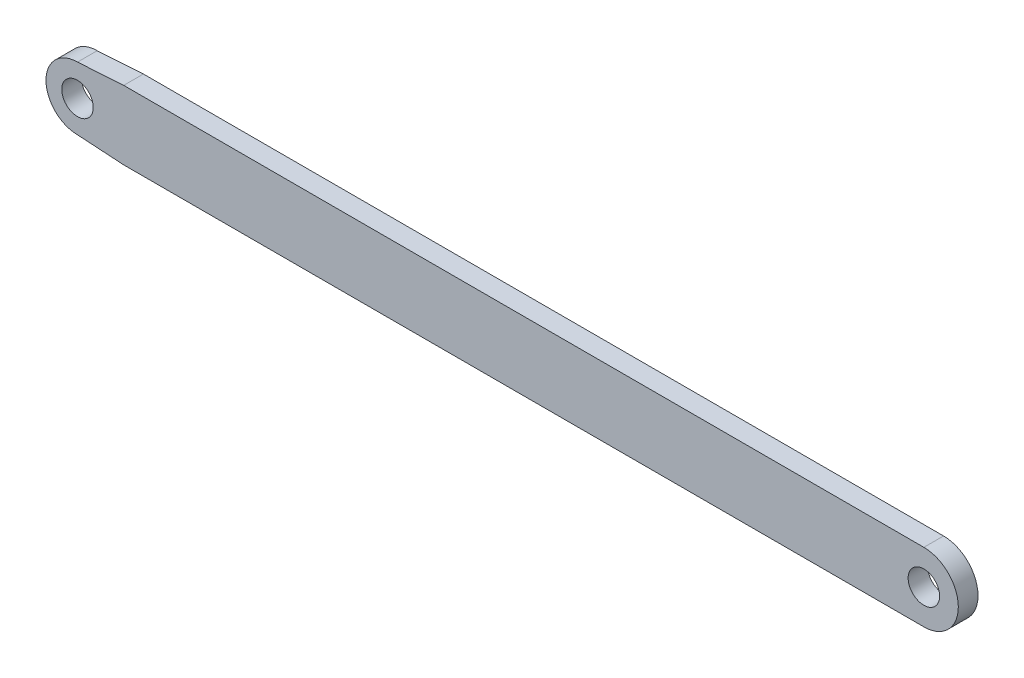
ISO-10303-21;
HEADER;
FILE_DESCRIPTION(('STEP AP214'),'2;1');
FILE_NAME('part.step','',(''),(''),'','','');
FILE_SCHEMA(('AUTOMOTIVE_DESIGN { 1 0 10303 214 1 1 1 1 }'));
ENDSEC;
DATA;
#1=APPLICATION_CONTEXT('core data for automotive mechanical design processes');
#2=APPLICATION_PROTOCOL_DEFINITION('international standard','automotive_design',2000,#1);
#3=PRODUCT_CONTEXT('',#1,'mechanical');
#4=PRODUCT('Part','Part','',(#3));
#5=PRODUCT_RELATED_PRODUCT_CATEGORY('part','',(#4));
#6=PRODUCT_DEFINITION_FORMATION('','',#4);
#7=PRODUCT_DEFINITION_CONTEXT('part definition',#1,'design');
#8=PRODUCT_DEFINITION('design','',#6,#7);
#9=PRODUCT_DEFINITION_SHAPE('','',#8);
#10=(LENGTH_UNIT() NAMED_UNIT(*) SI_UNIT(.MILLI.,.METRE.));
#11=(NAMED_UNIT(*) PLANE_ANGLE_UNIT() SI_UNIT($,.RADIAN.));
#12=(NAMED_UNIT(*) SI_UNIT($,.STERADIAN.) SOLID_ANGLE_UNIT());
#13=UNCERTAINTY_MEASURE_WITH_UNIT(LENGTH_MEASURE(1.E-05),#10,'distance_accuracy_value','');
#14=(GEOMETRIC_REPRESENTATION_CONTEXT(3) GLOBAL_UNCERTAINTY_ASSIGNED_CONTEXT((#13)) GLOBAL_UNIT_ASSIGNED_CONTEXT((#10,
#11,#12)) REPRESENTATION_CONTEXT('',''));
#15=CARTESIAN_POINT('',(0.,0.,0.));
#16=DIRECTION('',(0.,0.,1.));
#17=DIRECTION('',(1.,0.,0.));
#18=AXIS2_PLACEMENT_3D('',#15,#16,#17);
#19=CARTESIAN_POINT('',(1.56460188089036E-06,-8.75003844433416,5.));
#20=DIRECTION('',(-1.7881085790011E-07,0.999999999999984,0.));
#21=DIRECTION('',(-0.999999999999984,-1.7881085790011E-07,0.));
#22=AXIS2_PLACEMENT_3D('',#19,#20,#21);
#23=PLANE('',#22);
#24=DIRECTION('',(0.999999999999984,1.7881085790011E-07,0.));
#25=VECTOR('',#24,1.);
#26=CARTESIAN_POINT('',(1.56460188089036E-06,-8.75003844433416,0.));
#27=LINE('',#26,#25);
#28=CARTESIAN_POINT('',(7.45449875131523E-12,-8.75003844433444,0.));
#29=VERTEX_POINT('',#28);
#30=CARTESIAN_POINT('',(203.259167970718,-8.75000209938824,0.));
#31=VERTEX_POINT('',#30);
#32=EDGE_CURVE('E137',#29,#31,#27,.T.);
#33=ORIENTED_EDGE('',*,*,#32,.T.);
#34=DIRECTION('',(0.,0.,-1.));
#35=VECTOR('',#34,1.);
#36=CARTESIAN_POINT('',(203.259167970718,-8.75000209938824,5.));
#37=LINE('',#36,#35);
#38=CARTESIAN_POINT('',(203.259167970718,-8.75000209938824,5.));
#39=VERTEX_POINT('',#38);
#40=EDGE_CURVE('E11',#39,#31,#37,.T.);
#41=ORIENTED_EDGE('',*,*,#40,.F.);
#42=DIRECTION('',(0.999999999999984,1.7881085790011E-07,0.));
#43=VECTOR('',#42,1.);
#44=CARTESIAN_POINT('',(1.56460188089036E-06,-8.75003844433416,5.));
#45=LINE('',#44,#43);
#46=CARTESIAN_POINT('',(7.45449875131523E-12,-8.75003844433444,5.));
#47=VERTEX_POINT('',#46);
#48=EDGE_CURVE('E156',#47,#39,#45,.T.);
#49=ORIENTED_EDGE('',*,*,#48,.F.);
#50=DIRECTION('',(0.,0.,-1.));
#51=VECTOR('',#50,1.);
#52=CARTESIAN_POINT('',(7.45449875131523E-12,-8.75003844433444,5.));
#53=LINE('',#52,#51);
#54=EDGE_CURVE('E64',#47,#29,#53,.T.);
#55=ORIENTED_EDGE('',*,*,#54,.T.);
#56=EDGE_LOOP('',(#33,#41,#49,#55));
#57=FACE_BOUND('',#56,.T.);
#58=ADVANCED_FACE('F47',(#57),#23,.F.);
#59=CARTESIAN_POINT('',(203.259167970718,-2.09938810414106E-06,5.));
#60=DIRECTION('',(0.,0.,-1.));
#61=DIRECTION('',(-1.,0.,0.));
#62=AXIS2_PLACEMENT_3D('',#59,#60,#61);
#63=CYLINDRICAL_SURFACE('',#62,8.75);
#64=CARTESIAN_POINT('',(203.259167970718,-2.09938810414106E-06,0.));
#65=DIRECTION('',(0.,0.,1.));
#66=DIRECTION('',(1.,0.,0.));
#67=AXIS2_PLACEMENT_3D('',#64,#65,#66);
#68=CIRCLE('',#67,8.75);
#69=CARTESIAN_POINT('',(203.259167970718,8.7499979006119,0.));
#70=VERTEX_POINT('',#69);
#71=EDGE_CURVE('E140',#31,#70,#68,.T.);
#72=ORIENTED_EDGE('',*,*,#71,.T.);
#73=DIRECTION('',(0.,0.,-1.));
#74=VECTOR('',#73,1.);
#75=CARTESIAN_POINT('',(203.259167970718,8.7499979006119,5.));
#76=LINE('',#75,#74);
#77=CARTESIAN_POINT('',(203.259167970718,8.7499979006119,5.));
#78=VERTEX_POINT('',#77);
#79=EDGE_CURVE('E56',#78,#70,#76,.T.);
#80=ORIENTED_EDGE('',*,*,#79,.F.);
#81=CARTESIAN_POINT('',(203.259167970718,-2.09938810414106E-06,5.));
#82=DIRECTION('',(0.,0.,1.));
#83=DIRECTION('',(1.,0.,0.));
#84=AXIS2_PLACEMENT_3D('',#81,#82,#83);
#85=CIRCLE('',#84,8.75);
#86=EDGE_CURVE('E97',#39,#78,#85,.T.);
#87=ORIENTED_EDGE('',*,*,#86,.F.);
#88=ORIENTED_EDGE('',*,*,#40,.T.);
#89=EDGE_LOOP('',(#72,#80,#87,#88));
#90=FACE_BOUND('',#89,.T.);
#91=ADVANCED_FACE('F181',(#90),#63,.T.);
#92=CARTESIAN_POINT('',(0.,8.74999790061187,5.));
#93=DIRECTION('',(0.,-1.,0.));
#94=DIRECTION('',(1.,0.,0.));
#95=AXIS2_PLACEMENT_3D('',#92,#93,#94);
#96=PLANE('',#95);
#97=DIRECTION('',(-1.,0.,0.));
#98=VECTOR('',#97,1.);
#99=CARTESIAN_POINT('',(0.,8.74999790061187,0.));
#100=LINE('',#99,#98);
#101=CARTESIAN_POINT('',(0.,8.74999790061187,0.));
#102=VERTEX_POINT('',#101);
#103=EDGE_CURVE('E144',#70,#102,#100,.T.);
#104=ORIENTED_EDGE('',*,*,#103,.T.);
#105=DIRECTION('',(0.,0.,-1.));
#106=VECTOR('',#105,1.);
#107=CARTESIAN_POINT('',(0.,8.74999790061187,5.));
#108=LINE('',#107,#106);
#109=CARTESIAN_POINT('',(0.,8.74999790061187,5.));
#110=VERTEX_POINT('',#109);
#111=EDGE_CURVE('E127',#110,#102,#108,.T.);
#112=ORIENTED_EDGE('',*,*,#111,.F.);
#113=DIRECTION('',(-1.,0.,0.));
#114=VECTOR('',#113,1.);
#115=CARTESIAN_POINT('',(0.,8.74999790061187,5.));
#116=LINE('',#115,#114);
#117=EDGE_CURVE('E113',#78,#110,#116,.T.);
#118=ORIENTED_EDGE('',*,*,#117,.F.);
#119=ORIENTED_EDGE('',*,*,#79,.T.);
#120=EDGE_LOOP('',(#104,#112,#118,#119));
#121=FACE_BOUND('',#120,.T.);
#122=ADVANCED_FACE('F166',(#121),#96,.F.);
#123=CARTESIAN_POINT('',(-0.55667350625815,8.71443790282138,5.));
#124=DIRECTION('',(0.0637495154692273,-0.997965930920209,0.));
#125=DIRECTION('',(0.997965930920209,0.0637495154692273,0.));
#126=AXIS2_PLACEMENT_3D('',#123,#124,#125);
#127=PLANE('',#126);
#128=DIRECTION('',(-0.997965930920209,-0.0637495154692273,0.));
#129=VECTOR('',#128,1.);
#130=CARTESIAN_POINT('',(-0.55667350625815,8.71443790282138,0.));
#131=LINE('',#130,#129);
#132=CARTESIAN_POINT('',(-11.7408320292823,8.,0.));
#133=VERTEX_POINT('',#132);
#134=EDGE_CURVE('E123',#102,#133,#131,.T.);
#135=ORIENTED_EDGE('',*,*,#134,.T.);
#136=DIRECTION('',(0.,0.,-1.));
#137=VECTOR('',#136,1.);
#138=CARTESIAN_POINT('',(-11.7408320292823,8.,5.));
#139=LINE('',#138,#137);
#140=CARTESIAN_POINT('',(-11.7408320292823,8.,5.));
#141=VERTEX_POINT('',#140);
#142=EDGE_CURVE('E120',#141,#133,#139,.T.);
#143=ORIENTED_EDGE('',*,*,#142,.F.);
#144=DIRECTION('',(-0.997965930920209,-0.0637495154692273,0.));
#145=VECTOR('',#144,1.);
#146=CARTESIAN_POINT('',(-0.55667350625815,8.71443790282138,5.));
#147=LINE('',#146,#145);
#148=EDGE_CURVE('E106',#110,#141,#147,.T.);
#149=ORIENTED_EDGE('',*,*,#148,.F.);
#150=ORIENTED_EDGE('',*,*,#111,.T.);
#151=EDGE_LOOP('',(#135,#143,#149,#150));
#152=FACE_BOUND('',#151,.T.);
#153=ADVANCED_FACE('F121',(#152),#127,.F.);
#154=CARTESIAN_POINT('',(-11.7408320292823,0.,5.));
#155=DIRECTION('',(0.,0.,-1.));
#156=DIRECTION('',(-1.,0.,0.));
#157=AXIS2_PLACEMENT_3D('',#154,#155,#156);
#158=CYLINDRICAL_SURFACE('',#157,8.);
#159=CARTESIAN_POINT('',(-11.7408320292823,0.,0.));
#160=DIRECTION('',(0.,0.,1.));
#161=DIRECTION('',(1.,0.,0.));
#162=AXIS2_PLACEMENT_3D('',#159,#160,#161);
#163=CIRCLE('',#162,8.);
#164=CARTESIAN_POINT('',(-11.7408320292823,-8.,0.));
#165=VERTEX_POINT('',#164);
#166=EDGE_CURVE('E149',#133,#165,#163,.T.);
#167=ORIENTED_EDGE('',*,*,#166,.T.);
#168=DIRECTION('',(0.,0.,-1.));
#169=VECTOR('',#168,1.);
#170=CARTESIAN_POINT('',(-11.7408320292823,-8.,5.));
#171=LINE('',#170,#169);
#172=CARTESIAN_POINT('',(-11.7408320292823,-8.,5.));
#173=VERTEX_POINT('',#172);
#174=EDGE_CURVE('E85',#173,#165,#171,.T.);
#175=ORIENTED_EDGE('',*,*,#174,.F.);
#176=CARTESIAN_POINT('',(-11.7408320292823,0.,5.));
#177=DIRECTION('',(0.,0.,1.));
#178=DIRECTION('',(1.,0.,0.));
#179=AXIS2_PLACEMENT_3D('',#176,#177,#178);
#180=CIRCLE('',#179,8.);
#181=EDGE_CURVE('E111',#141,#173,#180,.T.);
#182=ORIENTED_EDGE('',*,*,#181,.F.);
#183=ORIENTED_EDGE('',*,*,#142,.T.);
#184=EDGE_LOOP('',(#167,#175,#182,#183));
#185=FACE_BOUND('',#184,.T.);
#186=ADVANCED_FACE('F129',(#185),#158,.T.);
#187=CARTESIAN_POINT('',(-0.556705934072331,-8.71447445264226,5.));
#188=DIRECTION('',(-0.0637529476625695,-0.997965711667657,0.));
#189=DIRECTION('',(0.997965711667657,-0.0637529476625695,0.));
#190=AXIS2_PLACEMENT_3D('',#187,#188,#189);
#191=PLANE('',#190);
#192=DIRECTION('',(-0.997965711667657,0.0637529476625695,0.));
#193=VECTOR('',#192,1.);
#194=CARTESIAN_POINT('',(-0.556705934072331,-8.71447445264226,0.));
#195=LINE('',#194,#193);
#196=EDGE_CURVE('E152',#29,#165,#195,.T.);
#197=ORIENTED_EDGE('',*,*,#196,.F.);
#198=ORIENTED_EDGE('',*,*,#54,.F.);
#199=DIRECTION('',(-0.997965711667657,0.0637529476625695,0.));
#200=VECTOR('',#199,1.);
#201=CARTESIAN_POINT('',(-0.556705934072331,-8.71447445264226,5.));
#202=LINE('',#201,#200);
#203=EDGE_CURVE('E131',#47,#173,#202,.T.);
#204=ORIENTED_EDGE('',*,*,#203,.T.);
#205=ORIENTED_EDGE('',*,*,#174,.T.);
#206=EDGE_LOOP('',(#197,#198,#204,#205));
#207=FACE_BOUND('',#206,.T.);
#208=ADVANCED_FACE('F169',(#207),#191,.T.);
#209=CARTESIAN_POINT('',(0.,0.,5.));
#210=DIRECTION('',(0.,0.,1.));
#211=DIRECTION('',(1.,0.,0.));
#212=AXIS2_PLACEMENT_3D('',#209,#210,#211);
#213=PLANE('',#212);
#214=CARTESIAN_POINT('',(-11.7408320292823,0.,5.));
#215=DIRECTION('',(0.,0.,1.));
#216=DIRECTION('',(1.,0.,0.));
#217=AXIS2_PLACEMENT_3D('',#214,#215,#216);
#218=CIRCLE('',#217,4.);
#219=CARTESIAN_POINT('',(-7.74083202928227,0.,5.));
#220=VERTEX_POINT('',#219);
#221=EDGE_CURVE('E200',#220,#220,#218,.T.);
#222=ORIENTED_EDGE('',*,*,#221,.F.);
#223=EDGE_LOOP('',(#222));
#224=FACE_BOUND('',#223,.T.);
#225=CARTESIAN_POINT('',(203.259167970718,-2.09938810414106E-06,5.));
#226=DIRECTION('',(0.,0.,1.));
#227=DIRECTION('',(1.,0.,0.));
#228=AXIS2_PLACEMENT_3D('',#225,#226,#227);
#229=CIRCLE('',#228,3.99999999999999);
#230=CARTESIAN_POINT('',(207.259167970718,-2.09938810414106E-06,5.));
#231=VERTEX_POINT('',#230);
#232=EDGE_CURVE('E196',#231,#231,#229,.T.);
#233=ORIENTED_EDGE('',*,*,#232,.F.);
#234=EDGE_LOOP('',(#233));
#235=FACE_BOUND('',#234,.T.);
#236=ORIENTED_EDGE('',*,*,#48,.T.);
#237=ORIENTED_EDGE('',*,*,#86,.T.);
#238=ORIENTED_EDGE('',*,*,#117,.T.);
#239=ORIENTED_EDGE('',*,*,#148,.T.);
#240=ORIENTED_EDGE('',*,*,#181,.T.);
#241=ORIENTED_EDGE('',*,*,#203,.F.);
#242=EDGE_LOOP('',(#236,#237,#238,#239,#240,#241));
#243=FACE_BOUND('',#242,.T.);
#244=ADVANCED_FACE('F108',(#224,#235,#243),#213,.T.);
#245=CARTESIAN_POINT('',(0.,0.,0.));
#246=DIRECTION('',(0.,0.,1.));
#247=DIRECTION('',(1.,0.,0.));
#248=AXIS2_PLACEMENT_3D('',#245,#246,#247);
#249=PLANE('',#248);
#250=CARTESIAN_POINT('',(-11.7408320292823,0.,0.));
#251=DIRECTION('',(0.,0.,1.));
#252=DIRECTION('',(1.,0.,0.));
#253=AXIS2_PLACEMENT_3D('',#250,#251,#252);
#254=CIRCLE('',#253,4.);
#255=CARTESIAN_POINT('',(-7.74083202928227,0.,0.));
#256=VERTEX_POINT('',#255);
#257=EDGE_CURVE('E141',#256,#256,#254,.T.);
#258=ORIENTED_EDGE('',*,*,#257,.T.);
#259=EDGE_LOOP('',(#258));
#260=FACE_BOUND('',#259,.T.);
#261=CARTESIAN_POINT('',(203.259167970718,-2.09938810414106E-06,0.));
#262=DIRECTION('',(0.,0.,1.));
#263=DIRECTION('',(1.,0.,0.));
#264=AXIS2_PLACEMENT_3D('',#261,#262,#263);
#265=CIRCLE('',#264,3.99999999999999);
#266=CARTESIAN_POINT('',(207.259167970718,-2.09938810414106E-06,0.));
#267=VERTEX_POINT('',#266);
#268=EDGE_CURVE('E191',#267,#267,#265,.T.);
#269=ORIENTED_EDGE('',*,*,#268,.T.);
#270=EDGE_LOOP('',(#269));
#271=FACE_BOUND('',#270,.T.);
#272=ORIENTED_EDGE('',*,*,#32,.F.);
#273=ORIENTED_EDGE('',*,*,#196,.T.);
#274=ORIENTED_EDGE('',*,*,#166,.F.);
#275=ORIENTED_EDGE('',*,*,#134,.F.);
#276=ORIENTED_EDGE('',*,*,#103,.F.);
#277=ORIENTED_EDGE('',*,*,#71,.F.);
#278=EDGE_LOOP('',(#272,#273,#274,#275,#276,#277));
#279=FACE_BOUND('',#278,.T.);
#280=ADVANCED_FACE('F168',(#260,#271,#279),#249,.F.);
#281=CARTESIAN_POINT('',(203.259167970718,-2.09938810414106E-06,0.));
#282=DIRECTION('',(0.,0.,1.));
#283=DIRECTION('',(1.,0.,0.));
#284=AXIS2_PLACEMENT_3D('',#281,#282,#283);
#285=CYLINDRICAL_SURFACE('',#284,3.99999999999999);
#286=ORIENTED_EDGE('',*,*,#268,.F.);
#287=EDGE_LOOP('',(#286));
#288=FACE_BOUND('',#287,.T.);
#289=ORIENTED_EDGE('',*,*,#232,.T.);
#290=EDGE_LOOP('',(#289));
#291=FACE_BOUND('',#290,.T.);
#292=ADVANCED_FACE('F213',(#288,#291),#285,.F.);
#293=CARTESIAN_POINT('',(-11.7408320292823,0.,0.));
#294=DIRECTION('',(0.,0.,1.));
#295=DIRECTION('',(1.,0.,0.));
#296=AXIS2_PLACEMENT_3D('',#293,#294,#295);
#297=CYLINDRICAL_SURFACE('',#296,4.);
#298=ORIENTED_EDGE('',*,*,#257,.F.);
#299=EDGE_LOOP('',(#298));
#300=FACE_BOUND('',#299,.T.);
#301=ORIENTED_EDGE('',*,*,#221,.T.);
#302=EDGE_LOOP('',(#301));
#303=FACE_BOUND('',#302,.T.);
#304=ADVANCED_FACE('F210',(#300,#303),#297,.F.);
#305=CLOSED_SHELL('',(#58,#91,#122,#153,#186,#208,#244,#280,#292,#304));
#306=MANIFOLD_SOLID_BREP('B2',#305);
#307=ADVANCED_BREP_SHAPE_REPRESENTATION('',(#18,#306),#14);
#308=SHAPE_DEFINITION_REPRESENTATION(#9,#307);
ENDSEC;
END-ISO-10303-21;
